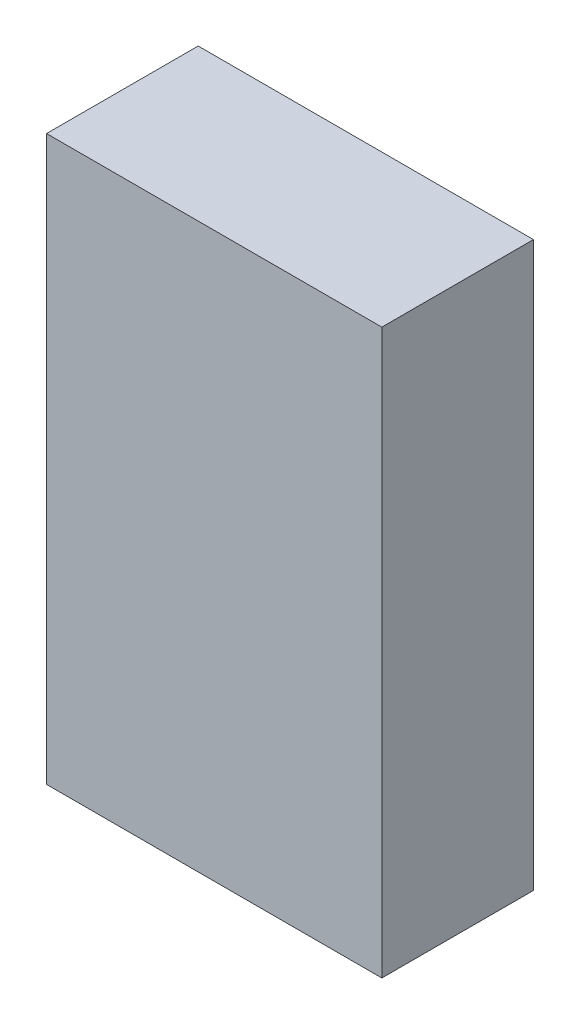
ISO-10303-21;
HEADER;
FILE_DESCRIPTION(('STEP AP214'),'2;1');
FILE_NAME('part.step','',(''),(''),'','','');
FILE_SCHEMA(('AUTOMOTIVE_DESIGN { 1 0 10303 214 1 1 1 1 }'));
ENDSEC;
DATA;
#1=APPLICATION_CONTEXT('core data for automotive mechanical design processes');
#2=APPLICATION_PROTOCOL_DEFINITION('international standard','automotive_design',2000,#1);
#3=PRODUCT_CONTEXT('',#1,'mechanical');
#4=PRODUCT('Part','Part','',(#3));
#5=PRODUCT_RELATED_PRODUCT_CATEGORY('part','',(#4));
#6=PRODUCT_DEFINITION_FORMATION('','',#4);
#7=PRODUCT_DEFINITION_CONTEXT('part definition',#1,'design');
#8=PRODUCT_DEFINITION('design','',#6,#7);
#9=PRODUCT_DEFINITION_SHAPE('','',#8);
#10=(LENGTH_UNIT() NAMED_UNIT(*) SI_UNIT(.MILLI.,.METRE.));
#11=(NAMED_UNIT(*) PLANE_ANGLE_UNIT() SI_UNIT($,.RADIAN.));
#12=(NAMED_UNIT(*) SI_UNIT($,.STERADIAN.) SOLID_ANGLE_UNIT());
#13=UNCERTAINTY_MEASURE_WITH_UNIT(LENGTH_MEASURE(1.E-05),#10,'distance_accuracy_value','');
#14=(GEOMETRIC_REPRESENTATION_CONTEXT(3) GLOBAL_UNCERTAINTY_ASSIGNED_CONTEXT((#13)) GLOBAL_UNIT_ASSIGNED_CONTEXT((#10,
#11,#12)) REPRESENTATION_CONTEXT('',''));
#15=CARTESIAN_POINT('',(0.,0.,0.));
#16=DIRECTION('',(0.,0.,1.));
#17=DIRECTION('',(1.,0.,0.));
#18=AXIS2_PLACEMENT_3D('',#15,#16,#17);
#19=CARTESIAN_POINT('',(17.25,-29.,15.6));
#20=DIRECTION('',(-1.,0.,0.));
#21=DIRECTION('',(0.,0.,1.));
#22=AXIS2_PLACEMENT_3D('',#19,#20,#21);
#23=PLANE('',#22);
#24=DIRECTION('',(0.,1.,0.));
#25=VECTOR('',#24,1.);
#26=CARTESIAN_POINT('',(17.25,-29.,0.));
#27=LINE('',#26,#25);
#28=CARTESIAN_POINT('',(17.25,-29.,0.));
#29=VERTEX_POINT('',#28);
#30=CARTESIAN_POINT('',(17.25,29.,0.));
#31=VERTEX_POINT('',#30);
#32=EDGE_CURVE('E102',#29,#31,#27,.T.);
#33=ORIENTED_EDGE('',*,*,#32,.T.);
#34=DIRECTION('',(0.,0.,-1.));
#35=VECTOR('',#34,1.);
#36=CARTESIAN_POINT('',(17.25,29.,15.6));
#37=LINE('',#36,#35);
#38=CARTESIAN_POINT('',(17.25,29.,15.6));
#39=VERTEX_POINT('',#38);
#40=EDGE_CURVE('E11',#39,#31,#37,.T.);
#41=ORIENTED_EDGE('',*,*,#40,.F.);
#42=DIRECTION('',(0.,1.,0.));
#43=VECTOR('',#42,1.);
#44=CARTESIAN_POINT('',(17.25,-29.,15.6));
#45=LINE('',#44,#43);
#46=CARTESIAN_POINT('',(17.25,-29.,15.6));
#47=VERTEX_POINT('',#46);
#48=EDGE_CURVE('E90',#47,#39,#45,.T.);
#49=ORIENTED_EDGE('',*,*,#48,.F.);
#50=DIRECTION('',(0.,0.,-1.));
#51=VECTOR('',#50,1.);
#52=CARTESIAN_POINT('',(17.25,-29.,15.6));
#53=LINE('',#52,#51);
#54=EDGE_CURVE('E98',#47,#29,#53,.T.);
#55=ORIENTED_EDGE('',*,*,#54,.T.);
#56=EDGE_LOOP('',(#33,#41,#49,#55));
#57=FACE_BOUND('',#56,.T.);
#58=ADVANCED_FACE('F39',(#57),#23,.F.);
#59=CARTESIAN_POINT('',(-17.25,29.,15.6));
#60=DIRECTION('',(0.,-1.,0.));
#61=DIRECTION('',(0.,0.,-1.));
#62=AXIS2_PLACEMENT_3D('',#59,#60,#61);
#63=PLANE('',#62);
#64=DIRECTION('',(-1.,0.,0.));
#65=VECTOR('',#64,1.);
#66=CARTESIAN_POINT('',(-17.25,29.,0.));
#67=LINE('',#66,#65);
#68=CARTESIAN_POINT('',(-17.25,29.,0.));
#69=VERTEX_POINT('',#68);
#70=EDGE_CURVE('E94',#31,#69,#67,.T.);
#71=ORIENTED_EDGE('',*,*,#70,.T.);
#72=DIRECTION('',(0.,0.,-1.));
#73=VECTOR('',#72,1.);
#74=CARTESIAN_POINT('',(-17.25,29.,15.6));
#75=LINE('',#74,#73);
#76=CARTESIAN_POINT('',(-17.25,29.,15.6));
#77=VERTEX_POINT('',#76);
#78=EDGE_CURVE('E47',#77,#69,#75,.T.);
#79=ORIENTED_EDGE('',*,*,#78,.F.);
#80=DIRECTION('',(-1.,0.,0.));
#81=VECTOR('',#80,1.);
#82=CARTESIAN_POINT('',(-17.25,29.,15.6));
#83=LINE('',#82,#81);
#84=EDGE_CURVE('E85',#39,#77,#83,.T.);
#85=ORIENTED_EDGE('',*,*,#84,.F.);
#86=ORIENTED_EDGE('',*,*,#40,.T.);
#87=EDGE_LOOP('',(#71,#79,#85,#86));
#88=FACE_BOUND('',#87,.T.);
#89=ADVANCED_FACE('F93',(#88),#63,.F.);
#90=CARTESIAN_POINT('',(-17.25,-29.,15.6));
#91=DIRECTION('',(1.,0.,0.));
#92=DIRECTION('',(0.,0.,-1.));
#93=AXIS2_PLACEMENT_3D('',#90,#91,#92);
#94=PLANE('',#93);
#95=DIRECTION('',(0.,-1.,0.));
#96=VECTOR('',#95,1.);
#97=CARTESIAN_POINT('',(-17.25,-29.,0.));
#98=LINE('',#97,#96);
#99=CARTESIAN_POINT('',(-17.25,-29.,0.));
#100=VERTEX_POINT('',#99);
#101=EDGE_CURVE('E72',#69,#100,#98,.T.);
#102=ORIENTED_EDGE('',*,*,#101,.T.);
#103=DIRECTION('',(0.,0.,-1.));
#104=VECTOR('',#103,1.);
#105=CARTESIAN_POINT('',(-17.25,-29.,15.6));
#106=LINE('',#105,#104);
#107=CARTESIAN_POINT('',(-17.25,-29.,15.6));
#108=VERTEX_POINT('',#107);
#109=EDGE_CURVE('E95',#108,#100,#106,.T.);
#110=ORIENTED_EDGE('',*,*,#109,.F.);
#111=DIRECTION('',(0.,-1.,0.));
#112=VECTOR('',#111,1.);
#113=CARTESIAN_POINT('',(-17.25,-29.,15.6));
#114=LINE('',#113,#112);
#115=EDGE_CURVE('E88',#77,#108,#114,.T.);
#116=ORIENTED_EDGE('',*,*,#115,.F.);
#117=ORIENTED_EDGE('',*,*,#78,.T.);
#118=EDGE_LOOP('',(#102,#110,#116,#117));
#119=FACE_BOUND('',#118,.T.);
#120=ADVANCED_FACE('F96',(#119),#94,.F.);
#121=CARTESIAN_POINT('',(-17.25,-29.,15.6));
#122=DIRECTION('',(0.,1.,0.));
#123=DIRECTION('',(0.,0.,1.));
#124=AXIS2_PLACEMENT_3D('',#121,#122,#123);
#125=PLANE('',#124);
#126=DIRECTION('',(1.,0.,0.));
#127=VECTOR('',#126,1.);
#128=CARTESIAN_POINT('',(-17.25,-29.,0.));
#129=LINE('',#128,#127);
#130=EDGE_CURVE('E78',#100,#29,#129,.T.);
#131=ORIENTED_EDGE('',*,*,#130,.T.);
#132=ORIENTED_EDGE('',*,*,#54,.F.);
#133=DIRECTION('',(1.,0.,0.));
#134=VECTOR('',#133,1.);
#135=CARTESIAN_POINT('',(-17.25,-29.,15.6));
#136=LINE('',#135,#134);
#137=EDGE_CURVE('E55',#108,#47,#136,.T.);
#138=ORIENTED_EDGE('',*,*,#137,.F.);
#139=ORIENTED_EDGE('',*,*,#109,.T.);
#140=EDGE_LOOP('',(#131,#132,#138,#139));
#141=FACE_BOUND('',#140,.T.);
#142=ADVANCED_FACE('F109',(#141),#125,.F.);
#143=CARTESIAN_POINT('',(0.,0.,15.6));
#144=DIRECTION('',(0.,0.,-1.));
#145=DIRECTION('',(-1.,0.,0.));
#146=AXIS2_PLACEMENT_3D('',#143,#144,#145);
#147=PLANE('',#146);
#148=ORIENTED_EDGE('',*,*,#48,.T.);
#149=ORIENTED_EDGE('',*,*,#84,.T.);
#150=ORIENTED_EDGE('',*,*,#115,.T.);
#151=ORIENTED_EDGE('',*,*,#137,.T.);
#152=EDGE_LOOP('',(#148,#149,#150,#151));
#153=FACE_BOUND('',#152,.T.);
#154=ADVANCED_FACE('F86',(#153),#147,.F.);
#155=CARTESIAN_POINT('',(0.,0.,0.));
#156=DIRECTION('',(0.,0.,-1.));
#157=DIRECTION('',(-1.,0.,0.));
#158=AXIS2_PLACEMENT_3D('',#155,#156,#157);
#159=PLANE('',#158);
#160=ORIENTED_EDGE('',*,*,#32,.F.);
#161=ORIENTED_EDGE('',*,*,#130,.F.);
#162=ORIENTED_EDGE('',*,*,#101,.F.);
#163=ORIENTED_EDGE('',*,*,#70,.F.);
#164=EDGE_LOOP('',(#160,#161,#162,#163));
#165=FACE_BOUND('',#164,.T.);
#166=ADVANCED_FACE('F112',(#165),#159,.T.);
#167=CLOSED_SHELL('',(#58,#89,#120,#142,#154,#166));
#168=MANIFOLD_SOLID_BREP('B2',#167);
#169=ADVANCED_BREP_SHAPE_REPRESENTATION('',(#18,#168),#14);
#170=SHAPE_DEFINITION_REPRESENTATION(#9,#169);
ENDSEC;
END-ISO-10303-21;
